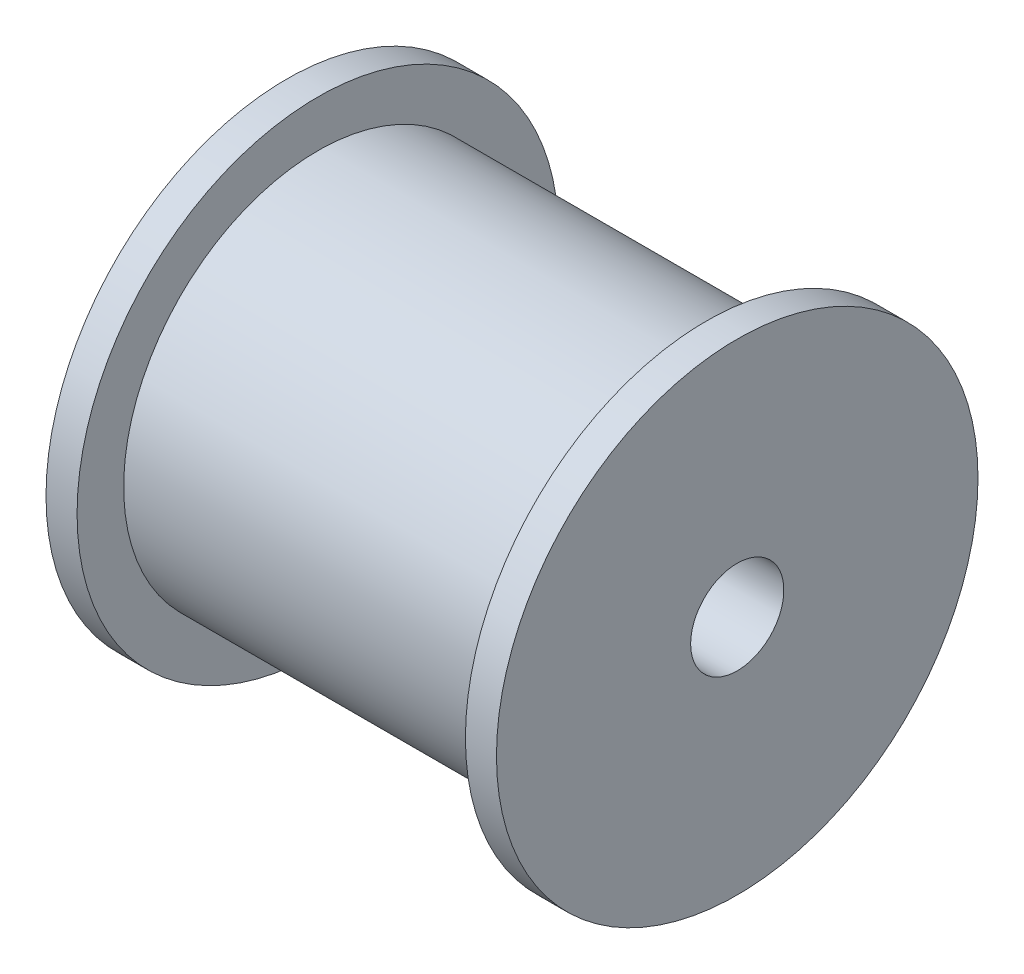
ISO-10303-21;
HEADER;
FILE_DESCRIPTION(('STEP AP214'),'2;1');
FILE_NAME('part.step','',(''),(''),'','','');
FILE_SCHEMA(('AUTOMOTIVE_DESIGN { 1 0 10303 214 1 1 1 1 }'));
ENDSEC;
DATA;
#1=APPLICATION_CONTEXT('core data for automotive mechanical design processes');
#2=APPLICATION_PROTOCOL_DEFINITION('international standard','automotive_design',2000,#1);
#3=PRODUCT_CONTEXT('',#1,'mechanical');
#4=PRODUCT('Part','Part','',(#3));
#5=PRODUCT_RELATED_PRODUCT_CATEGORY('part','',(#4));
#6=PRODUCT_DEFINITION_FORMATION('','',#4);
#7=PRODUCT_DEFINITION_CONTEXT('part definition',#1,'design');
#8=PRODUCT_DEFINITION('design','',#6,#7);
#9=PRODUCT_DEFINITION_SHAPE('','',#8);
#10=(LENGTH_UNIT() NAMED_UNIT(*) SI_UNIT(.MILLI.,.METRE.));
#11=(NAMED_UNIT(*) PLANE_ANGLE_UNIT() SI_UNIT($,.RADIAN.));
#12=(NAMED_UNIT(*) SI_UNIT($,.STERADIAN.) SOLID_ANGLE_UNIT());
#13=UNCERTAINTY_MEASURE_WITH_UNIT(LENGTH_MEASURE(1.E-05),#10,'distance_accuracy_value','');
#14=(GEOMETRIC_REPRESENTATION_CONTEXT(3) GLOBAL_UNCERTAINTY_ASSIGNED_CONTEXT((#13)) GLOBAL_UNIT_ASSIGNED_CONTEXT((#10,
#11,#12)) REPRESENTATION_CONTEXT('',''));
#15=CARTESIAN_POINT('',(0.,0.,0.));
#16=DIRECTION('',(0.,0.,1.));
#17=DIRECTION('',(1.,0.,0.));
#18=AXIS2_PLACEMENT_3D('',#15,#16,#17);
#19=CARTESIAN_POINT('',(250.,0.,0.));
#20=DIRECTION('',(-1.,0.,0.));
#21=DIRECTION('',(0.,0.,1.));
#22=AXIS2_PLACEMENT_3D('',#19,#20,#21);
#23=CYLINDRICAL_SURFACE('',#22,125.);
#24=CARTESIAN_POINT('',(250.,0.,0.));
#25=DIRECTION('',(1.,0.,0.));
#26=DIRECTION('',(0.,0.,-1.));
#27=AXIS2_PLACEMENT_3D('',#24,#25,#26);
#28=CIRCLE('',#27,125.);
#29=CARTESIAN_POINT('',(250.,0.,-125.));
#30=VERTEX_POINT('',#29);
#31=EDGE_CURVE('E10',#30,#30,#28,.T.);
#32=ORIENTED_EDGE('',*,*,#31,.F.);
#33=EDGE_LOOP('',(#32));
#34=FACE_BOUND('',#33,.T.);
#35=CARTESIAN_POINT('',(0.,0.,0.));
#36=DIRECTION('',(1.,0.,0.));
#37=DIRECTION('',(0.,0.,-1.));
#38=AXIS2_PLACEMENT_3D('',#35,#36,#37);
#39=CIRCLE('',#38,125.);
#40=CARTESIAN_POINT('',(0.,0.,-125.));
#41=VERTEX_POINT('',#40);
#42=EDGE_CURVE('E42',#41,#41,#39,.T.);
#43=ORIENTED_EDGE('',*,*,#42,.T.);
#44=EDGE_LOOP('',(#43));
#45=FACE_BOUND('',#44,.T.);
#46=ADVANCED_FACE('F39',(#34,#45),#23,.T.);
#47=CARTESIAN_POINT('',(-20.,0.,0.));
#48=DIRECTION('',(1.,0.,0.));
#49=DIRECTION('',(0.,0.,-1.));
#50=AXIS2_PLACEMENT_3D('',#47,#48,#49);
#51=CYLINDRICAL_SURFACE('',#50,155.);
#52=CARTESIAN_POINT('',(-20.,0.,0.));
#53=DIRECTION('',(1.,0.,0.));
#54=DIRECTION('',(0.,0.,-1.));
#55=AXIS2_PLACEMENT_3D('',#52,#53,#54);
#56=CIRCLE('',#55,155.);
#57=CARTESIAN_POINT('',(-20.,0.,-155.));
#58=VERTEX_POINT('',#57);
#59=EDGE_CURVE('E51',#58,#58,#56,.T.);
#60=ORIENTED_EDGE('',*,*,#59,.T.);
#61=EDGE_LOOP('',(#60));
#62=FACE_BOUND('',#61,.T.);
#63=CARTESIAN_POINT('',(0.,0.,0.));
#64=DIRECTION('',(1.,0.,0.));
#65=DIRECTION('',(0.,0.,-1.));
#66=AXIS2_PLACEMENT_3D('',#63,#64,#65);
#67=CIRCLE('',#66,155.);
#68=CARTESIAN_POINT('',(0.,0.,-155.));
#69=VERTEX_POINT('',#68);
#70=EDGE_CURVE('E53',#69,#69,#67,.T.);
#71=ORIENTED_EDGE('',*,*,#70,.F.);
#72=EDGE_LOOP('',(#71));
#73=FACE_BOUND('',#72,.T.);
#74=ADVANCED_FACE('F91',(#62,#73),#51,.T.);
#75=CARTESIAN_POINT('',(-20.,0.,0.));
#76=DIRECTION('',(1.,0.,0.));
#77=DIRECTION('',(0.,0.,-1.));
#78=AXIS2_PLACEMENT_3D('',#75,#76,#77);
#79=PLANE('',#78);
#80=CARTESIAN_POINT('',(-20.,0.,0.));
#81=DIRECTION('',(-1.,0.,0.));
#82=DIRECTION('',(0.,0.,1.));
#83=AXIS2_PLACEMENT_3D('',#80,#81,#82);
#84=CIRCLE('',#83,30.);
#85=CARTESIAN_POINT('',(-20.,0.,30.));
#86=VERTEX_POINT('',#85);
#87=EDGE_CURVE('E69',#86,#86,#84,.T.);
#88=ORIENTED_EDGE('',*,*,#87,.F.);
#89=EDGE_LOOP('',(#88));
#90=FACE_BOUND('',#89,.T.);
#91=ORIENTED_EDGE('',*,*,#59,.F.);
#92=EDGE_LOOP('',(#91));
#93=FACE_BOUND('',#92,.T.);
#94=ADVANCED_FACE('F87',(#90,#93),#79,.F.);
#95=CARTESIAN_POINT('',(0.,0.,0.));
#96=DIRECTION('',(1.,0.,0.));
#97=DIRECTION('',(0.,0.,-1.));
#98=AXIS2_PLACEMENT_3D('',#95,#96,#97);
#99=PLANE('',#98);
#100=ORIENTED_EDGE('',*,*,#42,.F.);
#101=EDGE_LOOP('',(#100));
#102=FACE_BOUND('',#101,.T.);
#103=ORIENTED_EDGE('',*,*,#70,.T.);
#104=EDGE_LOOP('',(#103));
#105=FACE_BOUND('',#104,.T.);
#106=ADVANCED_FACE('F90',(#102,#105),#99,.T.);
#107=CARTESIAN_POINT('',(270.,0.,0.));
#108=DIRECTION('',(-1.,0.,0.));
#109=DIRECTION('',(0.,0.,1.));
#110=AXIS2_PLACEMENT_3D('',#107,#108,#109);
#111=CYLINDRICAL_SURFACE('',#110,155.);
#112=CARTESIAN_POINT('',(270.,0.,0.));
#113=DIRECTION('',(1.,0.,0.));
#114=DIRECTION('',(0.,0.,-1.));
#115=AXIS2_PLACEMENT_3D('',#112,#113,#114);
#116=CIRCLE('',#115,155.);
#117=CARTESIAN_POINT('',(270.,0.,-155.));
#118=VERTEX_POINT('',#117);
#119=EDGE_CURVE('E57',#118,#118,#116,.T.);
#120=ORIENTED_EDGE('',*,*,#119,.F.);
#121=EDGE_LOOP('',(#120));
#122=FACE_BOUND('',#121,.T.);
#123=CARTESIAN_POINT('',(250.,0.,0.));
#124=DIRECTION('',(1.,0.,0.));
#125=DIRECTION('',(0.,0.,-1.));
#126=AXIS2_PLACEMENT_3D('',#123,#124,#125);
#127=CIRCLE('',#126,155.);
#128=CARTESIAN_POINT('',(250.,0.,-155.));
#129=VERTEX_POINT('',#128);
#130=EDGE_CURVE('E61',#129,#129,#127,.T.);
#131=ORIENTED_EDGE('',*,*,#130,.T.);
#132=EDGE_LOOP('',(#131));
#133=FACE_BOUND('',#132,.T.);
#134=ADVANCED_FACE('F100',(#122,#133),#111,.T.);
#135=CARTESIAN_POINT('',(270.,0.,0.));
#136=DIRECTION('',(-1.,0.,0.));
#137=DIRECTION('',(0.,0.,-1.));
#138=AXIS2_PLACEMENT_3D('',#135,#136,#137);
#139=PLANE('',#138);
#140=CARTESIAN_POINT('',(270.,0.,0.));
#141=DIRECTION('',(-1.,0.,0.));
#142=DIRECTION('',(0.,0.,1.));
#143=AXIS2_PLACEMENT_3D('',#140,#141,#142);
#144=CIRCLE('',#143,30.);
#145=CARTESIAN_POINT('',(270.,0.,30.));
#146=VERTEX_POINT('',#145);
#147=EDGE_CURVE('E65',#146,#146,#144,.T.);
#148=ORIENTED_EDGE('',*,*,#147,.T.);
#149=EDGE_LOOP('',(#148));
#150=FACE_BOUND('',#149,.T.);
#151=ORIENTED_EDGE('',*,*,#119,.T.);
#152=EDGE_LOOP('',(#151));
#153=FACE_BOUND('',#152,.T.);
#154=ADVANCED_FACE('F77',(#150,#153),#139,.F.);
#155=CARTESIAN_POINT('',(250.,0.,0.));
#156=DIRECTION('',(-1.,0.,0.));
#157=DIRECTION('',(0.,0.,-1.));
#158=AXIS2_PLACEMENT_3D('',#155,#156,#157);
#159=PLANE('',#158);
#160=ORIENTED_EDGE('',*,*,#31,.T.);
#161=EDGE_LOOP('',(#160));
#162=FACE_BOUND('',#161,.T.);
#163=ORIENTED_EDGE('',*,*,#130,.F.);
#164=EDGE_LOOP('',(#163));
#165=FACE_BOUND('',#164,.T.);
#166=ADVANCED_FACE('F83',(#162,#165),#159,.T.);
#167=CARTESIAN_POINT('',(270.,0.,0.));
#168=DIRECTION('',(-1.,0.,0.));
#169=DIRECTION('',(0.,0.,1.));
#170=AXIS2_PLACEMENT_3D('',#167,#168,#169);
#171=CYLINDRICAL_SURFACE('',#170,30.);
#172=ORIENTED_EDGE('',*,*,#147,.F.);
#173=EDGE_LOOP('',(#172));
#174=FACE_BOUND('',#173,.T.);
#175=ORIENTED_EDGE('',*,*,#87,.T.);
#176=EDGE_LOOP('',(#175));
#177=FACE_BOUND('',#176,.T.);
#178=ADVANCED_FACE('F80',(#174,#177),#171,.F.);
#179=CLOSED_SHELL('',(#46,#74,#94,#106,#134,#154,#166,#178));
#180=MANIFOLD_SOLID_BREP('B2',#179);
#181=ADVANCED_BREP_SHAPE_REPRESENTATION('',(#18,#180),#14);
#182=SHAPE_DEFINITION_REPRESENTATION(#9,#181);
ENDSEC;
END-ISO-10303-21;
